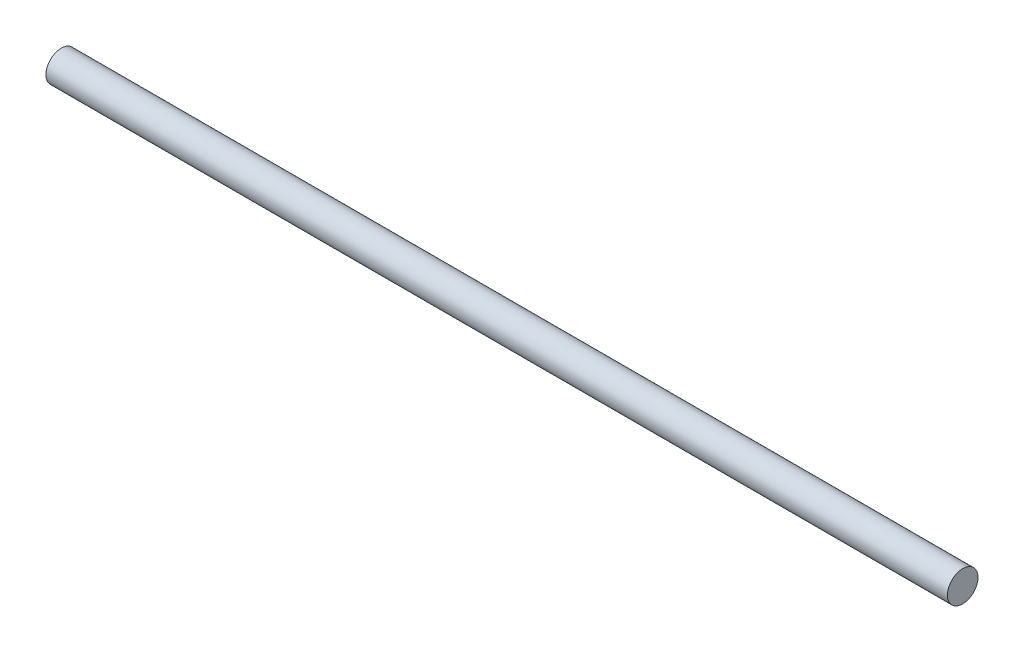
ISO-10303-21;
HEADER;
FILE_DESCRIPTION(('STEP AP214'),'2;1');
FILE_NAME('part.step','',(''),(''),'','','');
FILE_SCHEMA(('AUTOMOTIVE_DESIGN { 1 0 10303 214 1 1 1 1 }'));
ENDSEC;
DATA;
#1=APPLICATION_CONTEXT('core data for automotive mechanical design processes');
#2=APPLICATION_PROTOCOL_DEFINITION('international standard','automotive_design',2000,#1);
#3=PRODUCT_CONTEXT('',#1,'mechanical');
#4=PRODUCT('Part','Part','',(#3));
#5=PRODUCT_RELATED_PRODUCT_CATEGORY('part','',(#4));
#6=PRODUCT_DEFINITION_FORMATION('','',#4);
#7=PRODUCT_DEFINITION_CONTEXT('part definition',#1,'design');
#8=PRODUCT_DEFINITION('design','',#6,#7);
#9=PRODUCT_DEFINITION_SHAPE('','',#8);
#10=(LENGTH_UNIT() NAMED_UNIT(*) SI_UNIT(.MILLI.,.METRE.));
#11=(NAMED_UNIT(*) PLANE_ANGLE_UNIT() SI_UNIT($,.RADIAN.));
#12=(NAMED_UNIT(*) SI_UNIT($,.STERADIAN.) SOLID_ANGLE_UNIT());
#13=UNCERTAINTY_MEASURE_WITH_UNIT(LENGTH_MEASURE(1.E-05),#10,'distance_accuracy_value','');
#14=(GEOMETRIC_REPRESENTATION_CONTEXT(3) GLOBAL_UNCERTAINTY_ASSIGNED_CONTEXT((#13)) GLOBAL_UNIT_ASSIGNED_CONTEXT((#10,
#11,#12)) REPRESENTATION_CONTEXT('',''));
#15=CARTESIAN_POINT('',(0.,0.,0.));
#16=DIRECTION('',(0.,0.,1.));
#17=DIRECTION('',(1.,0.,0.));
#18=AXIS2_PLACEMENT_3D('',#15,#16,#17);
#19=CARTESIAN_POINT('',(88.49,0.,0.));
#20=DIRECTION('',(-1.,0.,0.));
#21=DIRECTION('',(0.,0.,1.));
#22=AXIS2_PLACEMENT_3D('',#19,#20,#21);
#23=CYLINDRICAL_SURFACE('',#22,1.5);
#24=CARTESIAN_POINT('',(88.49,0.,0.));
#25=DIRECTION('',(1.,0.,0.));
#26=DIRECTION('',(0.,0.,-1.));
#27=AXIS2_PLACEMENT_3D('',#24,#25,#26);
#28=CIRCLE('',#27,1.5);
#29=CARTESIAN_POINT('',(88.49,0.,-1.5));
#30=VERTEX_POINT('',#29);
#31=EDGE_CURVE('E10',#30,#30,#28,.T.);
#32=ORIENTED_EDGE('',*,*,#31,.F.);
#33=EDGE_LOOP('',(#32));
#34=FACE_BOUND('',#33,.T.);
#35=CARTESIAN_POINT('',(0.,0.,0.));
#36=DIRECTION('',(1.,0.,0.));
#37=DIRECTION('',(0.,0.,-1.));
#38=AXIS2_PLACEMENT_3D('',#35,#36,#37);
#39=CIRCLE('',#38,1.5);
#40=CARTESIAN_POINT('',(0.,0.,-1.5));
#41=VERTEX_POINT('',#40);
#42=EDGE_CURVE('E34',#41,#41,#39,.T.);
#43=ORIENTED_EDGE('',*,*,#42,.T.);
#44=EDGE_LOOP('',(#43));
#45=FACE_BOUND('',#44,.T.);
#46=ADVANCED_FACE('F31',(#34,#45),#23,.T.);
#47=CARTESIAN_POINT('',(88.49,0.,0.));
#48=DIRECTION('',(1.,0.,0.));
#49=DIRECTION('',(0.,0.,-1.));
#50=AXIS2_PLACEMENT_3D('',#47,#48,#49);
#51=PLANE('',#50);
#52=ORIENTED_EDGE('',*,*,#31,.T.);
#53=EDGE_LOOP('',(#52));
#54=FACE_BOUND('',#53,.T.);
#55=ADVANCED_FACE('F46',(#54),#51,.T.);
#56=CARTESIAN_POINT('',(0.,0.,0.));
#57=DIRECTION('',(1.,0.,0.));
#58=DIRECTION('',(0.,0.,-1.));
#59=AXIS2_PLACEMENT_3D('',#56,#57,#58);
#60=PLANE('',#59);
#61=ORIENTED_EDGE('',*,*,#42,.F.);
#62=EDGE_LOOP('',(#61));
#63=FACE_BOUND('',#62,.T.);
#64=ADVANCED_FACE('F44',(#63),#60,.F.);
#65=CLOSED_SHELL('',(#46,#55,#64));
#66=MANIFOLD_SOLID_BREP('B2',#65);
#67=ADVANCED_BREP_SHAPE_REPRESENTATION('',(#18,#66),#14);
#68=SHAPE_DEFINITION_REPRESENTATION(#9,#67);
ENDSEC;
END-ISO-10303-21;
